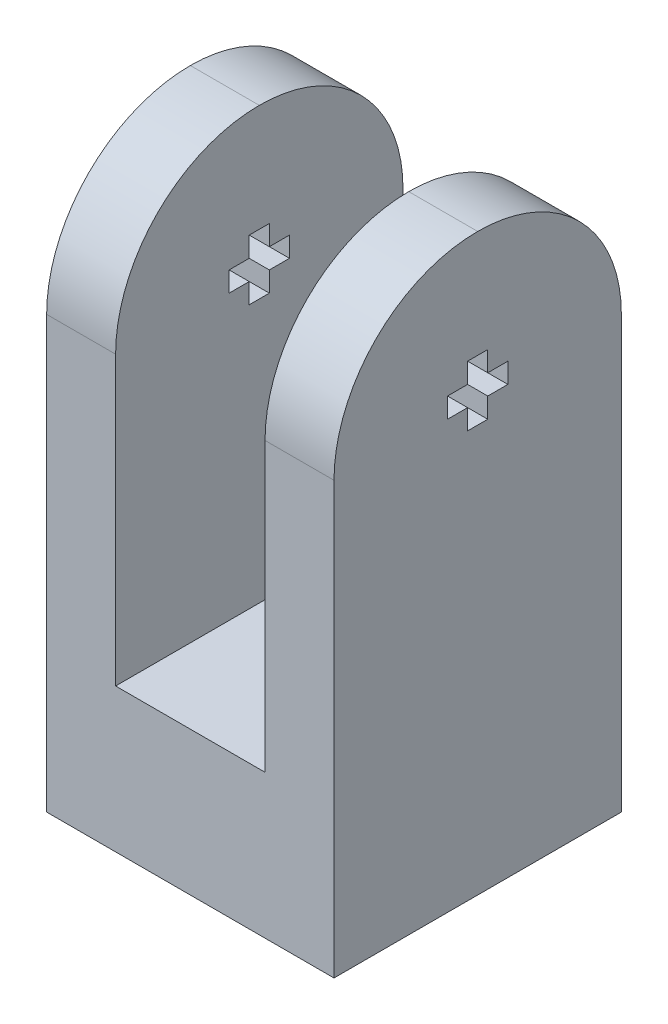
ISO-10303-21;
HEADER;
FILE_DESCRIPTION(('STEP AP214'),'2;1');
FILE_NAME('part.step','',(''),(''),'','','');
FILE_SCHEMA(('AUTOMOTIVE_DESIGN { 1 0 10303 214 1 1 1 1 }'));
ENDSEC;
DATA;
#1=APPLICATION_CONTEXT('core data for automotive mechanical design processes');
#2=APPLICATION_PROTOCOL_DEFINITION('international standard','automotive_design',2000,#1);
#3=PRODUCT_CONTEXT('',#1,'mechanical');
#4=PRODUCT('Part','Part','',(#3));
#5=PRODUCT_RELATED_PRODUCT_CATEGORY('part','',(#4));
#6=PRODUCT_DEFINITION_FORMATION('','',#4);
#7=PRODUCT_DEFINITION_CONTEXT('part definition',#1,'design');
#8=PRODUCT_DEFINITION('design','',#6,#7);
#9=PRODUCT_DEFINITION_SHAPE('','',#8);
#10=(LENGTH_UNIT() NAMED_UNIT(*) SI_UNIT(.MILLI.,.METRE.));
#11=(NAMED_UNIT(*) PLANE_ANGLE_UNIT() SI_UNIT($,.RADIAN.));
#12=(NAMED_UNIT(*) SI_UNIT($,.STERADIAN.) SOLID_ANGLE_UNIT());
#13=UNCERTAINTY_MEASURE_WITH_UNIT(LENGTH_MEASURE(1.E-05),#10,'distance_accuracy_value','');
#14=(GEOMETRIC_REPRESENTATION_CONTEXT(3) GLOBAL_UNCERTAINTY_ASSIGNED_CONTEXT((#13)) GLOBAL_UNIT_ASSIGNED_CONTEXT((#10,
#11,#12)) REPRESENTATION_CONTEXT('',''));
#15=CARTESIAN_POINT('',(0.,0.,0.));
#16=DIRECTION('',(0.,0.,1.));
#17=DIRECTION('',(1.,0.,0.));
#18=AXIS2_PLACEMENT_3D('',#15,#16,#17);
#19=CARTESIAN_POINT('',(12.7,50.8,12.7));
#20=DIRECTION('',(-1.,0.,0.));
#21=DIRECTION('',(0.,0.,1.));
#22=AXIS2_PLACEMENT_3D('',#19,#20,#21);
#23=PLANE('',#22);
#24=DIRECTION('',(0.,0.,-1.));
#25=VECTOR('',#24,1.);
#26=CARTESIAN_POINT('',(12.7,37.7560235760485,-0.888999999999999));
#27=LINE('',#26,#25);
#28=CARTESIAN_POINT('',(12.7,37.7560235760485,-0.888999999999999));
#29=VERTEX_POINT('',#28);
#30=CARTESIAN_POINT('',(12.7,37.7560235760485,-2.667));
#31=VERTEX_POINT('',#30);
#32=EDGE_CURVE('E326',#29,#31,#27,.T.);
#33=ORIENTED_EDGE('',*,*,#32,.F.);
#34=DIRECTION('',(0.,1.,0.));
#35=VECTOR('',#34,1.);
#36=CARTESIAN_POINT('',(12.7,37.7560235760485,-0.888999999999999));
#37=LINE('',#36,#35);
#38=CARTESIAN_POINT('',(12.7,35.9780235760485,-0.888999999999999));
#39=VERTEX_POINT('',#38);
#40=EDGE_CURVE('E324',#39,#29,#37,.T.);
#41=ORIENTED_EDGE('',*,*,#40,.F.);
#42=DIRECTION('',(0.,0.,-1.));
#43=VECTOR('',#42,1.);
#44=CARTESIAN_POINT('',(12.7,35.9780235760485,0.888999999999999));
#45=LINE('',#44,#43);
#46=CARTESIAN_POINT('',(12.7,35.9780235760485,0.888999999999999));
#47=VERTEX_POINT('',#46);
#48=EDGE_CURVE('E293',#47,#39,#45,.T.);
#49=ORIENTED_EDGE('',*,*,#48,.F.);
#50=DIRECTION('',(0.,-1.,0.));
#51=VECTOR('',#50,1.);
#52=CARTESIAN_POINT('',(12.7,37.7560235760485,0.888999999999999));
#53=LINE('',#52,#51);
#54=CARTESIAN_POINT('',(12.7,37.7560235760485,0.888999999999999));
#55=VERTEX_POINT('',#54);
#56=EDGE_CURVE('E296',#55,#47,#53,.T.);
#57=ORIENTED_EDGE('',*,*,#56,.F.);
#58=DIRECTION('',(0.,0.,-1.));
#59=VECTOR('',#58,1.);
#60=CARTESIAN_POINT('',(12.7,37.7560235760485,2.667));
#61=LINE('',#60,#59);
#62=CARTESIAN_POINT('',(12.7,37.7560235760485,2.667));
#63=VERTEX_POINT('',#62);
#64=EDGE_CURVE('E351',#63,#55,#61,.T.);
#65=ORIENTED_EDGE('',*,*,#64,.F.);
#66=DIRECTION('',(0.,-1.,0.));
#67=VECTOR('',#66,1.);
#68=CARTESIAN_POINT('',(12.7,39.5340235760485,2.667));
#69=LINE('',#68,#67);
#70=CARTESIAN_POINT('',(12.7,39.5340235760485,2.667));
#71=VERTEX_POINT('',#70);
#72=EDGE_CURVE('E348',#71,#63,#69,.T.);
#73=ORIENTED_EDGE('',*,*,#72,.F.);
#74=DIRECTION('',(0.,0.,1.));
#75=VECTOR('',#74,1.);
#76=CARTESIAN_POINT('',(12.7,39.5340235760485,2.667));
#77=LINE('',#76,#75);
#78=CARTESIAN_POINT('',(12.7,39.5340235760485,0.888999999999999));
#79=VERTEX_POINT('',#78);
#80=EDGE_CURVE('E345',#79,#71,#77,.T.);
#81=ORIENTED_EDGE('',*,*,#80,.F.);
#82=DIRECTION('',(0.,-1.,0.));
#83=VECTOR('',#82,1.);
#84=CARTESIAN_POINT('',(12.7,41.3120235760485,0.888999999999999));
#85=LINE('',#84,#83);
#86=CARTESIAN_POINT('',(12.7,41.3120235760485,0.888999999999999));
#87=VERTEX_POINT('',#86);
#88=EDGE_CURVE('E342',#87,#79,#85,.T.);
#89=ORIENTED_EDGE('',*,*,#88,.F.);
#90=DIRECTION('',(0.,0.,1.));
#91=VECTOR('',#90,1.);
#92=CARTESIAN_POINT('',(12.7,41.3120235760485,0.888999999999999));
#93=LINE('',#92,#91);
#94=CARTESIAN_POINT('',(12.7,41.3120235760485,-0.888999999999999));
#95=VERTEX_POINT('',#94);
#96=EDGE_CURVE('E339',#95,#87,#93,.T.);
#97=ORIENTED_EDGE('',*,*,#96,.F.);
#98=DIRECTION('',(0.,1.,0.));
#99=VECTOR('',#98,1.);
#100=CARTESIAN_POINT('',(12.7,41.3120235760485,-0.888999999999999));
#101=LINE('',#100,#99);
#102=CARTESIAN_POINT('',(12.7,39.5340235760485,-0.888999999999999));
#103=VERTEX_POINT('',#102);
#104=EDGE_CURVE('E336',#103,#95,#101,.T.);
#105=ORIENTED_EDGE('',*,*,#104,.F.);
#106=DIRECTION('',(0.,0.,1.));
#107=VECTOR('',#106,1.);
#108=CARTESIAN_POINT('',(12.7,39.5340235760485,-0.888999999999999));
#109=LINE('',#108,#107);
#110=CARTESIAN_POINT('',(12.7,39.5340235760485,-2.667));
#111=VERTEX_POINT('',#110);
#112=EDGE_CURVE('E333',#111,#103,#109,.T.);
#113=ORIENTED_EDGE('',*,*,#112,.F.);
#114=DIRECTION('',(0.,1.,0.));
#115=VECTOR('',#114,1.);
#116=CARTESIAN_POINT('',(12.7,39.5340235760485,-2.667));
#117=LINE('',#116,#115);
#118=EDGE_CURVE('E330',#31,#111,#117,.T.);
#119=ORIENTED_EDGE('',*,*,#118,.F.);
#120=EDGE_LOOP('',(#33,#41,#49,#57,#65,#73,#81,#89,#97,#105,#113,#119));
#121=FACE_BOUND('',#120,.T.);
#122=DIRECTION('',(0.,-1.,0.));
#123=VECTOR('',#122,1.);
#124=CARTESIAN_POINT('',(12.7,50.8,-12.7));
#125=LINE('',#124,#123);
#126=CARTESIAN_POINT('',(12.7,38.1,-12.7));
#127=VERTEX_POINT('',#126);
#128=CARTESIAN_POINT('',(12.7,0.,-12.7));
#129=VERTEX_POINT('',#128);
#130=EDGE_CURVE('E472',#127,#129,#125,.T.);
#131=ORIENTED_EDGE('',*,*,#130,.F.);
#132=CARTESIAN_POINT('',(12.7,38.1,0.));
#133=DIRECTION('',(-1.,0.,0.));
#134=DIRECTION('',(0.,0.,1.));
#135=AXIS2_PLACEMENT_3D('',#132,#133,#134);
#136=CIRCLE('',#135,12.7);
#137=CARTESIAN_POINT('',(12.7,50.8,0.));
#138=VERTEX_POINT('',#137);
#139=EDGE_CURVE('E519',#127,#138,#136,.F.);
#140=ORIENTED_EDGE('',*,*,#139,.T.);
#141=CARTESIAN_POINT('',(12.7,38.1,0.));
#142=DIRECTION('',(-1.,0.,0.));
#143=DIRECTION('',(0.,0.,1.));
#144=AXIS2_PLACEMENT_3D('',#141,#142,#143);
#145=CIRCLE('',#144,12.7);
#146=CARTESIAN_POINT('',(12.7,38.1,12.7));
#147=VERTEX_POINT('',#146);
#148=EDGE_CURVE('E517',#138,#147,#145,.F.);
#149=ORIENTED_EDGE('',*,*,#148,.T.);
#150=DIRECTION('',(0.,-1.,0.));
#151=VECTOR('',#150,1.);
#152=CARTESIAN_POINT('',(12.7,50.8,12.7));
#153=LINE('',#152,#151);
#154=CARTESIAN_POINT('',(12.7,0.,12.7));
#155=VERTEX_POINT('',#154);
#156=EDGE_CURVE('E466',#147,#155,#153,.T.);
#157=ORIENTED_EDGE('',*,*,#156,.T.);
#158=DIRECTION('',(0.,0.,-1.));
#159=VECTOR('',#158,1.);
#160=CARTESIAN_POINT('',(12.7,0.,12.7));
#161=LINE('',#160,#159);
#162=EDGE_CURVE('E448',#155,#129,#161,.T.);
#163=ORIENTED_EDGE('',*,*,#162,.T.);
#164=EDGE_LOOP('',(#131,#140,#149,#157,#163));
#165=FACE_BOUND('',#164,.T.);
#166=ADVANCED_FACE('F44',(#121,#165),#23,.F.);
#167=CARTESIAN_POINT('',(-12.7,50.8,-12.7));
#168=DIRECTION('',(0.,0.,1.));
#169=DIRECTION('',(1.,0.,0.));
#170=AXIS2_PLACEMENT_3D('',#167,#168,#169);
#171=PLANE('',#170);
#172=DIRECTION('',(0.,1.,0.));
#173=VECTOR('',#172,1.);
#174=CARTESIAN_POINT('',(6.604,12.7,-12.7));
#175=LINE('',#174,#173);
#176=CARTESIAN_POINT('',(6.604,12.7,-12.7));
#177=VERTEX_POINT('',#176);
#178=CARTESIAN_POINT('',(6.604,38.1,-12.7));
#179=VERTEX_POINT('',#178);
#180=EDGE_CURVE('E444',#177,#179,#175,.T.);
#181=ORIENTED_EDGE('',*,*,#180,.T.);
#182=DIRECTION('',(-1.,0.,0.));
#183=VECTOR('',#182,1.);
#184=CARTESIAN_POINT('',(-12.7,38.1,-12.7));
#185=LINE('',#184,#183);
#186=EDGE_CURVE('E514',#179,#127,#185,.F.);
#187=ORIENTED_EDGE('',*,*,#186,.T.);
#188=ORIENTED_EDGE('',*,*,#130,.T.);
#189=DIRECTION('',(-1.,0.,0.));
#190=VECTOR('',#189,1.);
#191=CARTESIAN_POINT('',(-12.7,0.,-12.7));
#192=LINE('',#191,#190);
#193=CARTESIAN_POINT('',(-12.7,0.,-12.7));
#194=VERTEX_POINT('',#193);
#195=EDGE_CURVE('E457',#129,#194,#192,.T.);
#196=ORIENTED_EDGE('',*,*,#195,.T.);
#197=DIRECTION('',(0.,-1.,0.));
#198=VECTOR('',#197,1.);
#199=CARTESIAN_POINT('',(-12.7,50.8,-12.7));
#200=LINE('',#199,#198);
#201=CARTESIAN_POINT('',(-12.7,38.1,-12.7));
#202=VERTEX_POINT('',#201);
#203=EDGE_CURVE('E470',#202,#194,#200,.T.);
#204=ORIENTED_EDGE('',*,*,#203,.F.);
#205=DIRECTION('',(-1.,0.,0.));
#206=VECTOR('',#205,1.);
#207=CARTESIAN_POINT('',(-12.7,38.1,-12.7));
#208=LINE('',#207,#206);
#209=CARTESIAN_POINT('',(-6.604,38.1,-12.7));
#210=VERTEX_POINT('',#209);
#211=EDGE_CURVE('E511',#202,#210,#208,.F.);
#212=ORIENTED_EDGE('',*,*,#211,.T.);
#213=DIRECTION('',(0.,1.,0.));
#214=VECTOR('',#213,1.);
#215=CARTESIAN_POINT('',(-6.604,12.7,-12.7));
#216=LINE('',#215,#214);
#217=CARTESIAN_POINT('',(-6.604,12.7,-12.7));
#218=VERTEX_POINT('',#217);
#219=EDGE_CURVE('E451',#218,#210,#216,.T.);
#220=ORIENTED_EDGE('',*,*,#219,.F.);
#221=DIRECTION('',(-1.,0.,0.));
#222=VECTOR('',#221,1.);
#223=CARTESIAN_POINT('',(-6.604,12.7,-12.7));
#224=LINE('',#223,#222);
#225=EDGE_CURVE('E435',#177,#218,#224,.T.);
#226=ORIENTED_EDGE('',*,*,#225,.F.);
#227=EDGE_LOOP('',(#181,#187,#188,#196,#204,#212,#220,#226));
#228=FACE_BOUND('',#227,.T.);
#229=ADVANCED_FACE('F567',(#228),#171,.F.);
#230=CARTESIAN_POINT('',(-12.7,50.8,12.7));
#231=DIRECTION('',(1.,0.,0.));
#232=DIRECTION('',(0.,0.,-1.));
#233=AXIS2_PLACEMENT_3D('',#230,#231,#232);
#234=PLANE('',#233);
#235=DIRECTION('',(0.,0.,-1.));
#236=VECTOR('',#235,1.);
#237=CARTESIAN_POINT('',(-12.7,35.9780235760485,0.888999999999999));
#238=LINE('',#237,#236);
#239=CARTESIAN_POINT('',(-12.7,35.9780235760485,0.888999999999999));
#240=VERTEX_POINT('',#239);
#241=CARTESIAN_POINT('',(-12.7,35.9780235760485,-0.888999999999999));
#242=VERTEX_POINT('',#241);
#243=EDGE_CURVE('E292',#240,#242,#238,.T.);
#244=ORIENTED_EDGE('',*,*,#243,.T.);
#245=DIRECTION('',(0.,1.,0.));
#246=VECTOR('',#245,1.);
#247=CARTESIAN_POINT('',(-12.7,37.7560235760485,-0.888999999999999));
#248=LINE('',#247,#246);
#249=CARTESIAN_POINT('',(-12.7,37.7560235760485,-0.888999999999999));
#250=VERTEX_POINT('',#249);
#251=EDGE_CURVE('E269',#242,#250,#248,.T.);
#252=ORIENTED_EDGE('',*,*,#251,.T.);
#253=DIRECTION('',(0.,0.,-1.));
#254=VECTOR('',#253,1.);
#255=CARTESIAN_POINT('',(-12.7,37.7560235760485,-0.888999999999999));
#256=LINE('',#255,#254);
#257=CARTESIAN_POINT('',(-12.7,37.7560235760485,-2.667));
#258=VERTEX_POINT('',#257);
#259=EDGE_CURVE('E280',#250,#258,#256,.T.);
#260=ORIENTED_EDGE('',*,*,#259,.T.);
#261=DIRECTION('',(0.,1.,0.));
#262=VECTOR('',#261,1.);
#263=CARTESIAN_POINT('',(-12.7,39.5340235760485,-2.667));
#264=LINE('',#263,#262);
#265=CARTESIAN_POINT('',(-12.7,39.5340235760485,-2.667));
#266=VERTEX_POINT('',#265);
#267=EDGE_CURVE('E286',#258,#266,#264,.T.);
#268=ORIENTED_EDGE('',*,*,#267,.T.);
#269=DIRECTION('',(0.,0.,1.));
#270=VECTOR('',#269,1.);
#271=CARTESIAN_POINT('',(-12.7,39.5340235760485,-0.888999999999999));
#272=LINE('',#271,#270);
#273=CARTESIAN_POINT('',(-12.7,39.5340235760485,-0.888999999999999));
#274=VERTEX_POINT('',#273);
#275=EDGE_CURVE('E300',#266,#274,#272,.T.);
#276=ORIENTED_EDGE('',*,*,#275,.T.);
#277=DIRECTION('',(0.,1.,0.));
#278=VECTOR('',#277,1.);
#279=CARTESIAN_POINT('',(-12.7,41.3120235760485,-0.888999999999999));
#280=LINE('',#279,#278);
#281=CARTESIAN_POINT('',(-12.7,41.3120235760485,-0.888999999999999));
#282=VERTEX_POINT('',#281);
#283=EDGE_CURVE('E303',#274,#282,#280,.T.);
#284=ORIENTED_EDGE('',*,*,#283,.T.);
#285=DIRECTION('',(0.,0.,1.));
#286=VECTOR('',#285,1.);
#287=CARTESIAN_POINT('',(-12.7,41.3120235760485,0.888999999999999));
#288=LINE('',#287,#286);
#289=CARTESIAN_POINT('',(-12.7,41.3120235760485,0.888999999999999));
#290=VERTEX_POINT('',#289);
#291=EDGE_CURVE('E306',#282,#290,#288,.T.);
#292=ORIENTED_EDGE('',*,*,#291,.T.);
#293=DIRECTION('',(0.,-1.,0.));
#294=VECTOR('',#293,1.);
#295=CARTESIAN_POINT('',(-12.7,41.3120235760485,0.888999999999999));
#296=LINE('',#295,#294);
#297=CARTESIAN_POINT('',(-12.7,39.5340235760485,0.888999999999999));
#298=VERTEX_POINT('',#297);
#299=EDGE_CURVE('E309',#290,#298,#296,.T.);
#300=ORIENTED_EDGE('',*,*,#299,.T.);
#301=DIRECTION('',(0.,0.,1.));
#302=VECTOR('',#301,1.);
#303=CARTESIAN_POINT('',(-12.7,39.5340235760485,2.667));
#304=LINE('',#303,#302);
#305=CARTESIAN_POINT('',(-12.7,39.5340235760485,2.667));
#306=VERTEX_POINT('',#305);
#307=EDGE_CURVE('E312',#298,#306,#304,.T.);
#308=ORIENTED_EDGE('',*,*,#307,.T.);
#309=DIRECTION('',(0.,-1.,0.));
#310=VECTOR('',#309,1.);
#311=CARTESIAN_POINT('',(-12.7,39.5340235760485,2.667));
#312=LINE('',#311,#310);
#313=CARTESIAN_POINT('',(-12.7,37.7560235760485,2.667));
#314=VERTEX_POINT('',#313);
#315=EDGE_CURVE('E315',#306,#314,#312,.T.);
#316=ORIENTED_EDGE('',*,*,#315,.T.);
#317=DIRECTION('',(0.,0.,-1.));
#318=VECTOR('',#317,1.);
#319=CARTESIAN_POINT('',(-12.7,37.7560235760485,2.667));
#320=LINE('',#319,#318);
#321=CARTESIAN_POINT('',(-12.7,37.7560235760485,0.888999999999999));
#322=VERTEX_POINT('',#321);
#323=EDGE_CURVE('E318',#314,#322,#320,.T.);
#324=ORIENTED_EDGE('',*,*,#323,.T.);
#325=DIRECTION('',(0.,-1.,0.));
#326=VECTOR('',#325,1.);
#327=CARTESIAN_POINT('',(-12.7,37.7560235760485,0.888999999999999));
#328=LINE('',#327,#326);
#329=EDGE_CURVE('E321',#322,#240,#328,.T.);
#330=ORIENTED_EDGE('',*,*,#329,.T.);
#331=EDGE_LOOP('',(#244,#252,#260,#268,#276,#284,#292,#300,#308,#316,#324,#330));
#332=FACE_BOUND('',#331,.T.);
#333=CARTESIAN_POINT('',(-12.7,38.1,0.));
#334=DIRECTION('',(1.,0.,0.));
#335=DIRECTION('',(0.,0.,-1.));
#336=AXIS2_PLACEMENT_3D('',#333,#334,#335);
#337=CIRCLE('',#336,12.7);
#338=CARTESIAN_POINT('',(-12.7,38.1,12.7));
#339=VERTEX_POINT('',#338);
#340=CARTESIAN_POINT('',(-12.7,50.8,0.));
#341=VERTEX_POINT('',#340);
#342=EDGE_CURVE('E521',#339,#341,#337,.F.);
#343=ORIENTED_EDGE('',*,*,#342,.T.);
#344=CARTESIAN_POINT('',(-12.7,38.1,0.));
#345=DIRECTION('',(1.,0.,0.));
#346=DIRECTION('',(0.,0.,-1.));
#347=AXIS2_PLACEMENT_3D('',#344,#345,#346);
#348=CIRCLE('',#347,12.7);
#349=EDGE_CURVE('E523',#341,#202,#348,.F.);
#350=ORIENTED_EDGE('',*,*,#349,.T.);
#351=ORIENTED_EDGE('',*,*,#203,.T.);
#352=DIRECTION('',(0.,0.,1.));
#353=VECTOR('',#352,1.);
#354=CARTESIAN_POINT('',(-12.7,0.,12.7));
#355=LINE('',#354,#353);
#356=CARTESIAN_POINT('',(-12.7,0.,12.7));
#357=VERTEX_POINT('',#356);
#358=EDGE_CURVE('E460',#194,#357,#355,.T.);
#359=ORIENTED_EDGE('',*,*,#358,.T.);
#360=DIRECTION('',(0.,-1.,0.));
#361=VECTOR('',#360,1.);
#362=CARTESIAN_POINT('',(-12.7,50.8,12.7));
#363=LINE('',#362,#361);
#364=EDGE_CURVE('E468',#339,#357,#363,.T.);
#365=ORIENTED_EDGE('',*,*,#364,.F.);
#366=EDGE_LOOP('',(#343,#350,#351,#359,#365));
#367=FACE_BOUND('',#366,.T.);
#368=ADVANCED_FACE('F288',(#332,#367),#234,.F.);
#369=CARTESIAN_POINT('',(-12.7,50.8,12.7));
#370=DIRECTION('',(0.,0.,-1.));
#371=DIRECTION('',(-1.,0.,0.));
#372=AXIS2_PLACEMENT_3D('',#369,#370,#371);
#373=PLANE('',#372);
#374=DIRECTION('',(0.,1.,0.));
#375=VECTOR('',#374,1.);
#376=CARTESIAN_POINT('',(-6.604,12.7,12.7));
#377=LINE('',#376,#375);
#378=CARTESIAN_POINT('',(-6.604,12.7,12.7));
#379=VERTEX_POINT('',#378);
#380=CARTESIAN_POINT('',(-6.604,38.1,12.7));
#381=VERTEX_POINT('',#380);
#382=EDGE_CURVE('E449',#379,#381,#377,.T.);
#383=ORIENTED_EDGE('',*,*,#382,.T.);
#384=DIRECTION('',(1.,0.,0.));
#385=VECTOR('',#384,1.);
#386=CARTESIAN_POINT('',(-12.7,38.1,12.7));
#387=LINE('',#386,#385);
#388=EDGE_CURVE('E11',#381,#339,#387,.F.);
#389=ORIENTED_EDGE('',*,*,#388,.T.);
#390=ORIENTED_EDGE('',*,*,#364,.T.);
#391=DIRECTION('',(1.,0.,0.));
#392=VECTOR('',#391,1.);
#393=CARTESIAN_POINT('',(-12.7,0.,12.7));
#394=LINE('',#393,#392);
#395=EDGE_CURVE('E463',#357,#155,#394,.T.);
#396=ORIENTED_EDGE('',*,*,#395,.T.);
#397=ORIENTED_EDGE('',*,*,#156,.F.);
#398=DIRECTION('',(1.,0.,0.));
#399=VECTOR('',#398,1.);
#400=CARTESIAN_POINT('',(-12.7,38.1,12.7));
#401=LINE('',#400,#399);
#402=CARTESIAN_POINT('',(6.604,38.1,12.7));
#403=VERTEX_POINT('',#402);
#404=EDGE_CURVE('E53',#147,#403,#401,.F.);
#405=ORIENTED_EDGE('',*,*,#404,.T.);
#406=DIRECTION('',(0.,1.,0.));
#407=VECTOR('',#406,1.);
#408=CARTESIAN_POINT('',(6.604,12.7,12.7));
#409=LINE('',#408,#407);
#410=CARTESIAN_POINT('',(6.604,12.7,12.7));
#411=VERTEX_POINT('',#410);
#412=EDGE_CURVE('E445',#411,#403,#409,.T.);
#413=ORIENTED_EDGE('',*,*,#412,.F.);
#414=DIRECTION('',(1.,0.,0.));
#415=VECTOR('',#414,1.);
#416=CARTESIAN_POINT('',(-6.604,12.7,12.7));
#417=LINE('',#416,#415);
#418=EDGE_CURVE('E441',#379,#411,#417,.T.);
#419=ORIENTED_EDGE('',*,*,#418,.F.);
#420=EDGE_LOOP('',(#383,#389,#390,#396,#397,#405,#413,#419));
#421=FACE_BOUND('',#420,.T.);
#422=ADVANCED_FACE('F542',(#421),#373,.F.);
#423=CARTESIAN_POINT('',(0.,0.,0.));
#424=DIRECTION('',(0.,-1.,0.));
#425=DIRECTION('',(0.,0.,-1.));
#426=AXIS2_PLACEMENT_3D('',#423,#424,#425);
#427=PLANE('',#426);
#428=ORIENTED_EDGE('',*,*,#162,.F.);
#429=ORIENTED_EDGE('',*,*,#395,.F.);
#430=ORIENTED_EDGE('',*,*,#358,.F.);
#431=ORIENTED_EDGE('',*,*,#195,.F.);
#432=EDGE_LOOP('',(#428,#429,#430,#431));
#433=FACE_BOUND('',#432,.T.);
#434=ADVANCED_FACE('F550',(#433),#427,.T.);
#435=CARTESIAN_POINT('',(6.604,12.7,12.7));
#436=DIRECTION('',(1.,0.,0.));
#437=DIRECTION('',(0.,0.,-1.));
#438=AXIS2_PLACEMENT_3D('',#435,#436,#437);
#439=PLANE('',#438);
#440=DIRECTION('',(0.,0.,-1.));
#441=VECTOR('',#440,1.);
#442=CARTESIAN_POINT('',(6.604,35.9780235760485,12.7));
#443=LINE('',#442,#441);
#444=CARTESIAN_POINT('',(6.604,35.9780235760485,0.888999999999999));
#445=VERTEX_POINT('',#444);
#446=CARTESIAN_POINT('',(6.604,35.9780235760485,-0.888999999999999));
#447=VERTEX_POINT('',#446);
#448=EDGE_CURVE('E426',#445,#447,#443,.T.);
#449=ORIENTED_EDGE('',*,*,#448,.T.);
#450=DIRECTION('',(0.,1.,0.));
#451=VECTOR('',#450,1.);
#452=CARTESIAN_POINT('',(6.604,12.7,-0.888999999999999));
#453=LINE('',#452,#451);
#454=CARTESIAN_POINT('',(6.604,37.7560235760485,-0.888999999999999));
#455=VERTEX_POINT('',#454);
#456=EDGE_CURVE('E429',#447,#455,#453,.T.);
#457=ORIENTED_EDGE('',*,*,#456,.T.);
#458=DIRECTION('',(0.,0.,-1.));
#459=VECTOR('',#458,1.);
#460=CARTESIAN_POINT('',(6.604,37.7560235760485,12.7));
#461=LINE('',#460,#459);
#462=CARTESIAN_POINT('',(6.604,37.7560235760485,-2.667));
#463=VERTEX_POINT('',#462);
#464=EDGE_CURVE('E358',#455,#463,#461,.T.);
#465=ORIENTED_EDGE('',*,*,#464,.T.);
#466=DIRECTION('',(0.,1.,0.));
#467=VECTOR('',#466,1.);
#468=CARTESIAN_POINT('',(6.604,12.7,-2.667));
#469=LINE('',#468,#467);
#470=CARTESIAN_POINT('',(6.604,39.5340235760485,-2.667));
#471=VERTEX_POINT('',#470);
#472=EDGE_CURVE('E399',#463,#471,#469,.T.);
#473=ORIENTED_EDGE('',*,*,#472,.T.);
#474=DIRECTION('',(0.,0.,1.));
#475=VECTOR('',#474,1.);
#476=CARTESIAN_POINT('',(6.604,39.5340235760485,12.7));
#477=LINE('',#476,#475);
#478=CARTESIAN_POINT('',(6.604,39.5340235760485,-0.888999999999999));
#479=VERTEX_POINT('',#478);
#480=EDGE_CURVE('E402',#471,#479,#477,.T.);
#481=ORIENTED_EDGE('',*,*,#480,.T.);
#482=DIRECTION('',(0.,1.,0.));
#483=VECTOR('',#482,1.);
#484=CARTESIAN_POINT('',(6.604,12.7,-0.888999999999999));
#485=LINE('',#484,#483);
#486=CARTESIAN_POINT('',(6.604,41.3120235760485,-0.888999999999999));
#487=VERTEX_POINT('',#486);
#488=EDGE_CURVE('E405',#479,#487,#485,.T.);
#489=ORIENTED_EDGE('',*,*,#488,.T.);
#490=DIRECTION('',(0.,0.,1.));
#491=VECTOR('',#490,1.);
#492=CARTESIAN_POINT('',(6.604,41.3120235760485,12.7));
#493=LINE('',#492,#491);
#494=CARTESIAN_POINT('',(6.604,41.3120235760485,0.888999999999999));
#495=VERTEX_POINT('',#494);
#496=EDGE_CURVE('E408',#487,#495,#493,.T.);
#497=ORIENTED_EDGE('',*,*,#496,.T.);
#498=DIRECTION('',(0.,-1.,0.));
#499=VECTOR('',#498,1.);
#500=CARTESIAN_POINT('',(6.604,12.7,0.888999999999999));
#501=LINE('',#500,#499);
#502=CARTESIAN_POINT('',(6.604,39.5340235760485,0.888999999999999));
#503=VERTEX_POINT('',#502);
#504=EDGE_CURVE('E411',#495,#503,#501,.T.);
#505=ORIENTED_EDGE('',*,*,#504,.T.);
#506=DIRECTION('',(0.,0.,1.));
#507=VECTOR('',#506,1.);
#508=CARTESIAN_POINT('',(6.604,39.5340235760485,12.7));
#509=LINE('',#508,#507);
#510=CARTESIAN_POINT('',(6.604,39.5340235760485,2.667));
#511=VERTEX_POINT('',#510);
#512=EDGE_CURVE('E414',#503,#511,#509,.T.);
#513=ORIENTED_EDGE('',*,*,#512,.T.);
#514=DIRECTION('',(0.,-1.,0.));
#515=VECTOR('',#514,1.);
#516=CARTESIAN_POINT('',(6.604,12.7,2.66699999999998));
#517=LINE('',#516,#515);
#518=CARTESIAN_POINT('',(6.604,37.7560235760485,2.667));
#519=VERTEX_POINT('',#518);
#520=EDGE_CURVE('E417',#511,#519,#517,.T.);
#521=ORIENTED_EDGE('',*,*,#520,.T.);
#522=DIRECTION('',(0.,0.,-1.));
#523=VECTOR('',#522,1.);
#524=CARTESIAN_POINT('',(6.604,37.7560235760485,12.7));
#525=LINE('',#524,#523);
#526=CARTESIAN_POINT('',(6.604,37.7560235760485,0.888999999999999));
#527=VERTEX_POINT('',#526);
#528=EDGE_CURVE('E420',#519,#527,#525,.T.);
#529=ORIENTED_EDGE('',*,*,#528,.T.);
#530=DIRECTION('',(0.,-1.,0.));
#531=VECTOR('',#530,1.);
#532=CARTESIAN_POINT('',(6.604,12.7,0.888999999999999));
#533=LINE('',#532,#531);
#534=EDGE_CURVE('E423',#527,#445,#533,.T.);
#535=ORIENTED_EDGE('',*,*,#534,.T.);
#536=EDGE_LOOP('',(#449,#457,#465,#473,#481,#489,#497,#505,#513,#521,#529,#535));
#537=FACE_BOUND('',#536,.T.);
#538=CARTESIAN_POINT('',(6.604,38.1,0.));
#539=DIRECTION('',(1.,0.,0.));
#540=DIRECTION('',(0.,0.,-1.));
#541=AXIS2_PLACEMENT_3D('',#538,#539,#540);
#542=CIRCLE('',#541,12.7);
#543=CARTESIAN_POINT('',(6.604,50.8,0.));
#544=VERTEX_POINT('',#543);
#545=EDGE_CURVE('E507',#403,#544,#542,.F.);
#546=ORIENTED_EDGE('',*,*,#545,.T.);
#547=CARTESIAN_POINT('',(6.604,38.1,0.));
#548=DIRECTION('',(1.,0.,0.));
#549=DIRECTION('',(0.,0.,-1.));
#550=AXIS2_PLACEMENT_3D('',#547,#548,#549);
#551=CIRCLE('',#550,12.7);
#552=EDGE_CURVE('E509',#544,#179,#551,.F.);
#553=ORIENTED_EDGE('',*,*,#552,.T.);
#554=ORIENTED_EDGE('',*,*,#180,.F.);
#555=DIRECTION('',(0.,0.,-1.));
#556=VECTOR('',#555,1.);
#557=CARTESIAN_POINT('',(6.604,12.7,12.7));
#558=LINE('',#557,#556);
#559=EDGE_CURVE('E432',#411,#177,#558,.T.);
#560=ORIENTED_EDGE('',*,*,#559,.F.);
#561=ORIENTED_EDGE('',*,*,#412,.T.);
#562=EDGE_LOOP('',(#546,#553,#554,#560,#561));
#563=FACE_BOUND('',#562,.T.);
#564=ADVANCED_FACE('F560',(#537,#563),#439,.F.);
#565=CARTESIAN_POINT('',(-6.604,12.7,12.7));
#566=DIRECTION('',(-1.,0.,0.));
#567=DIRECTION('',(0.,0.,1.));
#568=AXIS2_PLACEMENT_3D('',#565,#566,#567);
#569=PLANE('',#568);
#570=DIRECTION('',(0.,0.,1.));
#571=VECTOR('',#570,1.);
#572=CARTESIAN_POINT('',(-6.604,37.7560235760485,12.7));
#573=LINE('',#572,#571);
#574=CARTESIAN_POINT('',(-6.604,37.7560235760485,-2.667));
#575=VERTEX_POINT('',#574);
#576=CARTESIAN_POINT('',(-6.604,37.7560235760485,-0.888999999999999));
#577=VERTEX_POINT('',#576);
#578=EDGE_CURVE('E474',#575,#577,#573,.T.);
#579=ORIENTED_EDGE('',*,*,#578,.T.);
#580=DIRECTION('',(0.,-1.,0.));
#581=VECTOR('',#580,1.);
#582=CARTESIAN_POINT('',(-6.604,12.7,-0.888999999999999));
#583=LINE('',#582,#581);
#584=CARTESIAN_POINT('',(-6.604,35.9780235760485,-0.888999999999999));
#585=VERTEX_POINT('',#584);
#586=EDGE_CURVE('E272',#577,#585,#583,.T.);
#587=ORIENTED_EDGE('',*,*,#586,.T.);
#588=DIRECTION('',(0.,0.,1.));
#589=VECTOR('',#588,1.);
#590=CARTESIAN_POINT('',(-6.604,35.9780235760485,12.7));
#591=LINE('',#590,#589);
#592=CARTESIAN_POINT('',(-6.604,35.9780235760485,0.888999999999999));
#593=VERTEX_POINT('',#592);
#594=EDGE_CURVE('E503',#585,#593,#591,.T.);
#595=ORIENTED_EDGE('',*,*,#594,.T.);
#596=DIRECTION('',(0.,1.,0.));
#597=VECTOR('',#596,1.);
#598=CARTESIAN_POINT('',(-6.604,12.7,0.888999999999999));
#599=LINE('',#598,#597);
#600=CARTESIAN_POINT('',(-6.604,37.7560235760485,0.888999999999999));
#601=VERTEX_POINT('',#600);
#602=EDGE_CURVE('E500',#593,#601,#599,.T.);
#603=ORIENTED_EDGE('',*,*,#602,.T.);
#604=DIRECTION('',(0.,0.,1.));
#605=VECTOR('',#604,1.);
#606=CARTESIAN_POINT('',(-6.604,37.7560235760485,12.7));
#607=LINE('',#606,#605);
#608=CARTESIAN_POINT('',(-6.604,37.7560235760485,2.667));
#609=VERTEX_POINT('',#608);
#610=EDGE_CURVE('E497',#601,#609,#607,.T.);
#611=ORIENTED_EDGE('',*,*,#610,.T.);
#612=DIRECTION('',(0.,1.,0.));
#613=VECTOR('',#612,1.);
#614=CARTESIAN_POINT('',(-6.604,12.7,2.66699999999998));
#615=LINE('',#614,#613);
#616=CARTESIAN_POINT('',(-6.604,39.5340235760485,2.667));
#617=VERTEX_POINT('',#616);
#618=EDGE_CURVE('E494',#609,#617,#615,.T.);
#619=ORIENTED_EDGE('',*,*,#618,.T.);
#620=DIRECTION('',(0.,0.,-1.));
#621=VECTOR('',#620,1.);
#622=CARTESIAN_POINT('',(-6.604,39.5340235760485,12.7));
#623=LINE('',#622,#621);
#624=CARTESIAN_POINT('',(-6.604,39.5340235760485,0.888999999999999));
#625=VERTEX_POINT('',#624);
#626=EDGE_CURVE('E491',#617,#625,#623,.T.);
#627=ORIENTED_EDGE('',*,*,#626,.T.);
#628=DIRECTION('',(0.,1.,0.));
#629=VECTOR('',#628,1.);
#630=CARTESIAN_POINT('',(-6.604,12.7,0.888999999999999));
#631=LINE('',#630,#629);
#632=CARTESIAN_POINT('',(-6.604,41.3120235760485,0.888999999999999));
#633=VERTEX_POINT('',#632);
#634=EDGE_CURVE('E488',#625,#633,#631,.T.);
#635=ORIENTED_EDGE('',*,*,#634,.T.);
#636=DIRECTION('',(0.,0.,-1.));
#637=VECTOR('',#636,1.);
#638=CARTESIAN_POINT('',(-6.604,41.3120235760485,12.7));
#639=LINE('',#638,#637);
#640=CARTESIAN_POINT('',(-6.604,41.3120235760485,-0.888999999999999));
#641=VERTEX_POINT('',#640);
#642=EDGE_CURVE('E485',#633,#641,#639,.T.);
#643=ORIENTED_EDGE('',*,*,#642,.T.);
#644=DIRECTION('',(0.,-1.,0.));
#645=VECTOR('',#644,1.);
#646=CARTESIAN_POINT('',(-6.604,12.7,-0.888999999999999));
#647=LINE('',#646,#645);
#648=CARTESIAN_POINT('',(-6.604,39.5340235760485,-0.888999999999999));
#649=VERTEX_POINT('',#648);
#650=EDGE_CURVE('E482',#641,#649,#647,.T.);
#651=ORIENTED_EDGE('',*,*,#650,.T.);
#652=DIRECTION('',(0.,0.,-1.));
#653=VECTOR('',#652,1.);
#654=CARTESIAN_POINT('',(-6.604,39.5340235760485,12.7));
#655=LINE('',#654,#653);
#656=CARTESIAN_POINT('',(-6.604,39.5340235760485,-2.667));
#657=VERTEX_POINT('',#656);
#658=EDGE_CURVE('E479',#649,#657,#655,.T.);
#659=ORIENTED_EDGE('',*,*,#658,.T.);
#660=DIRECTION('',(0.,-1.,0.));
#661=VECTOR('',#660,1.);
#662=CARTESIAN_POINT('',(-6.604,12.7,-2.667));
#663=LINE('',#662,#661);
#664=EDGE_CURVE('E476',#657,#575,#663,.T.);
#665=ORIENTED_EDGE('',*,*,#664,.T.);
#666=EDGE_LOOP('',(#579,#587,#595,#603,#611,#619,#627,#635,#643,#651,#659,#665));
#667=FACE_BOUND('',#666,.T.);
#668=ORIENTED_EDGE('',*,*,#219,.T.);
#669=CARTESIAN_POINT('',(-6.604,38.1,0.));
#670=DIRECTION('',(-1.,0.,0.));
#671=DIRECTION('',(0.,0.,1.));
#672=AXIS2_PLACEMENT_3D('',#669,#670,#671);
#673=CIRCLE('',#672,12.7);
#674=CARTESIAN_POINT('',(-6.604,50.8,0.));
#675=VERTEX_POINT('',#674);
#676=EDGE_CURVE('E66',#210,#675,#673,.F.);
#677=ORIENTED_EDGE('',*,*,#676,.T.);
#678=CARTESIAN_POINT('',(-6.604,38.1,0.));
#679=DIRECTION('',(-1.,0.,0.));
#680=DIRECTION('',(0.,0.,1.));
#681=AXIS2_PLACEMENT_3D('',#678,#679,#680);
#682=CIRCLE('',#681,12.7);
#683=EDGE_CURVE('E61',#675,#381,#682,.F.);
#684=ORIENTED_EDGE('',*,*,#683,.T.);
#685=ORIENTED_EDGE('',*,*,#382,.F.);
#686=DIRECTION('',(0.,0.,1.));
#687=VECTOR('',#686,1.);
#688=CARTESIAN_POINT('',(-6.604,12.7,12.7));
#689=LINE('',#688,#687);
#690=EDGE_CURVE('E438',#218,#379,#689,.T.);
#691=ORIENTED_EDGE('',*,*,#690,.F.);
#692=EDGE_LOOP('',(#668,#677,#684,#685,#691));
#693=FACE_BOUND('',#692,.T.);
#694=ADVANCED_FACE('F565',(#667,#693),#569,.F.);
#695=CARTESIAN_POINT('',(0.,12.7,0.));
#696=DIRECTION('',(0.,-1.,0.));
#697=DIRECTION('',(0.,0.,-1.));
#698=AXIS2_PLACEMENT_3D('',#695,#696,#697);
#699=PLANE('',#698);
#700=ORIENTED_EDGE('',*,*,#559,.T.);
#701=ORIENTED_EDGE('',*,*,#225,.T.);
#702=ORIENTED_EDGE('',*,*,#690,.T.);
#703=ORIENTED_EDGE('',*,*,#418,.T.);
#704=EDGE_LOOP('',(#700,#701,#702,#703));
#705=FACE_BOUND('',#704,.T.);
#706=ADVANCED_FACE('F562',(#705),#699,.F.);
#707=CARTESIAN_POINT('',(-12.7,37.7560235760485,-0.888999999999999));
#708=DIRECTION('',(0.,-1.,0.));
#709=DIRECTION('',(0.,0.,-1.));
#710=AXIS2_PLACEMENT_3D('',#707,#708,#709);
#711=PLANE('',#710);
#712=DIRECTION('',(1.,0.,0.));
#713=VECTOR('',#712,1.);
#714=CARTESIAN_POINT('',(-12.7,37.7560235760485,-2.667));
#715=LINE('',#714,#713);
#716=EDGE_CURVE('E283',#258,#575,#715,.T.);
#717=ORIENTED_EDGE('',*,*,#716,.F.);
#718=ORIENTED_EDGE('',*,*,#259,.F.);
#719=DIRECTION('',(1.,0.,0.));
#720=VECTOR('',#719,1.);
#721=CARTESIAN_POINT('',(-12.7,37.7560235760485,-0.888999999999999));
#722=LINE('',#721,#720);
#723=EDGE_CURVE('E264',#250,#577,#722,.T.);
#724=ORIENTED_EDGE('',*,*,#723,.T.);
#725=ORIENTED_EDGE('',*,*,#578,.F.);
#726=EDGE_LOOP('',(#717,#718,#724,#725));
#727=FACE_BOUND('',#726,.T.);
#728=ADVANCED_FACE('F281',(#727),#711,.F.);
#729=CARTESIAN_POINT('',(-12.7,39.5340235760485,-2.667));
#730=DIRECTION('',(0.,0.,-1.));
#731=DIRECTION('',(-1.,0.,0.));
#732=AXIS2_PLACEMENT_3D('',#729,#730,#731);
#733=PLANE('',#732);
#734=DIRECTION('',(1.,0.,0.));
#735=VECTOR('',#734,1.);
#736=CARTESIAN_POINT('',(-12.7,39.5340235760485,-2.667));
#737=LINE('',#736,#735);
#738=EDGE_CURVE('E392',#266,#657,#737,.T.);
#739=ORIENTED_EDGE('',*,*,#738,.F.);
#740=ORIENTED_EDGE('',*,*,#267,.F.);
#741=ORIENTED_EDGE('',*,*,#716,.T.);
#742=ORIENTED_EDGE('',*,*,#664,.F.);
#743=EDGE_LOOP('',(#739,#740,#741,#742));
#744=FACE_BOUND('',#743,.T.);
#745=ADVANCED_FACE('F615',(#744),#733,.F.);
#746=CARTESIAN_POINT('',(-12.7,39.5340235760485,-0.888999999999999));
#747=DIRECTION('',(0.,1.,0.));
#748=DIRECTION('',(0.,0.,1.));
#749=AXIS2_PLACEMENT_3D('',#746,#747,#748);
#750=PLANE('',#749);
#751=DIRECTION('',(1.,0.,0.));
#752=VECTOR('',#751,1.);
#753=CARTESIAN_POINT('',(-12.7,39.5340235760485,-0.888999999999999));
#754=LINE('',#753,#752);
#755=EDGE_CURVE('E388',#274,#649,#754,.T.);
#756=ORIENTED_EDGE('',*,*,#755,.F.);
#757=ORIENTED_EDGE('',*,*,#275,.F.);
#758=ORIENTED_EDGE('',*,*,#738,.T.);
#759=ORIENTED_EDGE('',*,*,#658,.F.);
#760=EDGE_LOOP('',(#756,#757,#758,#759));
#761=FACE_BOUND('',#760,.T.);
#762=ADVANCED_FACE('F620',(#761),#750,.F.);
#763=CARTESIAN_POINT('',(-12.7,41.3120235760485,-0.888999999999999));
#764=DIRECTION('',(0.,0.,-1.));
#765=DIRECTION('',(-1.,0.,0.));
#766=AXIS2_PLACEMENT_3D('',#763,#764,#765);
#767=PLANE('',#766);
#768=DIRECTION('',(1.,0.,0.));
#769=VECTOR('',#768,1.);
#770=CARTESIAN_POINT('',(-12.7,41.3120235760485,-0.888999999999999));
#771=LINE('',#770,#769);
#772=EDGE_CURVE('E384',#282,#641,#771,.T.);
#773=ORIENTED_EDGE('',*,*,#772,.F.);
#774=ORIENTED_EDGE('',*,*,#283,.F.);
#775=ORIENTED_EDGE('',*,*,#755,.T.);
#776=ORIENTED_EDGE('',*,*,#650,.F.);
#777=EDGE_LOOP('',(#773,#774,#775,#776));
#778=FACE_BOUND('',#777,.T.);
#779=ADVANCED_FACE('F625',(#778),#767,.F.);
#780=CARTESIAN_POINT('',(-12.7,41.3120235760485,0.888999999999999));
#781=DIRECTION('',(0.,1.,0.));
#782=DIRECTION('',(0.,0.,1.));
#783=AXIS2_PLACEMENT_3D('',#780,#781,#782);
#784=PLANE('',#783);
#785=DIRECTION('',(1.,0.,0.));
#786=VECTOR('',#785,1.);
#787=CARTESIAN_POINT('',(-12.7,41.3120235760485,0.888999999999999));
#788=LINE('',#787,#786);
#789=EDGE_CURVE('E380',#290,#633,#788,.T.);
#790=ORIENTED_EDGE('',*,*,#789,.F.);
#791=ORIENTED_EDGE('',*,*,#291,.F.);
#792=ORIENTED_EDGE('',*,*,#772,.T.);
#793=ORIENTED_EDGE('',*,*,#642,.F.);
#794=EDGE_LOOP('',(#790,#791,#792,#793));
#795=FACE_BOUND('',#794,.T.);
#796=ADVANCED_FACE('F630',(#795),#784,.F.);
#797=CARTESIAN_POINT('',(-12.7,41.3120235760485,0.888999999999999));
#798=DIRECTION('',(0.,0.,1.));
#799=DIRECTION('',(1.,0.,0.));
#800=AXIS2_PLACEMENT_3D('',#797,#798,#799);
#801=PLANE('',#800);
#802=DIRECTION('',(1.,0.,0.));
#803=VECTOR('',#802,1.);
#804=CARTESIAN_POINT('',(-12.7,39.5340235760485,0.888999999999999));
#805=LINE('',#804,#803);
#806=EDGE_CURVE('E376',#298,#625,#805,.T.);
#807=ORIENTED_EDGE('',*,*,#806,.F.);
#808=ORIENTED_EDGE('',*,*,#299,.F.);
#809=ORIENTED_EDGE('',*,*,#789,.T.);
#810=ORIENTED_EDGE('',*,*,#634,.F.);
#811=EDGE_LOOP('',(#807,#808,#809,#810));
#812=FACE_BOUND('',#811,.T.);
#813=ADVANCED_FACE('F635',(#812),#801,.F.);
#814=CARTESIAN_POINT('',(-12.7,39.5340235760485,2.667));
#815=DIRECTION('',(0.,1.,0.));
#816=DIRECTION('',(0.,0.,1.));
#817=AXIS2_PLACEMENT_3D('',#814,#815,#816);
#818=PLANE('',#817);
#819=DIRECTION('',(1.,0.,0.));
#820=VECTOR('',#819,1.);
#821=CARTESIAN_POINT('',(-12.7,39.5340235760485,2.667));
#822=LINE('',#821,#820);
#823=EDGE_CURVE('E372',#306,#617,#822,.T.);
#824=ORIENTED_EDGE('',*,*,#823,.F.);
#825=ORIENTED_EDGE('',*,*,#307,.F.);
#826=ORIENTED_EDGE('',*,*,#806,.T.);
#827=ORIENTED_EDGE('',*,*,#626,.F.);
#828=EDGE_LOOP('',(#824,#825,#826,#827));
#829=FACE_BOUND('',#828,.T.);
#830=ADVANCED_FACE('F640',(#829),#818,.F.);
#831=CARTESIAN_POINT('',(-12.7,39.5340235760485,2.667));
#832=DIRECTION('',(0.,0.,1.));
#833=DIRECTION('',(0.,-1.,0.));
#834=AXIS2_PLACEMENT_3D('',#831,#832,#833);
#835=PLANE('',#834);
#836=DIRECTION('',(1.,0.,0.));
#837=VECTOR('',#836,1.);
#838=CARTESIAN_POINT('',(-12.7,37.7560235760485,2.667));
#839=LINE('',#838,#837);
#840=EDGE_CURVE('E368',#314,#609,#839,.T.);
#841=ORIENTED_EDGE('',*,*,#840,.F.);
#842=ORIENTED_EDGE('',*,*,#315,.F.);
#843=ORIENTED_EDGE('',*,*,#823,.T.);
#844=ORIENTED_EDGE('',*,*,#618,.F.);
#845=EDGE_LOOP('',(#841,#842,#843,#844));
#846=FACE_BOUND('',#845,.T.);
#847=ADVANCED_FACE('F645',(#846),#835,.F.);
#848=CARTESIAN_POINT('',(-12.7,37.7560235760485,2.667));
#849=DIRECTION('',(0.,-1.,0.));
#850=DIRECTION('',(0.,0.,-1.));
#851=AXIS2_PLACEMENT_3D('',#848,#849,#850);
#852=PLANE('',#851);
#853=DIRECTION('',(1.,0.,0.));
#854=VECTOR('',#853,1.);
#855=CARTESIAN_POINT('',(-12.7,37.7560235760485,0.888999999999999));
#856=LINE('',#855,#854);
#857=EDGE_CURVE('E364',#322,#601,#856,.T.);
#858=ORIENTED_EDGE('',*,*,#857,.F.);
#859=ORIENTED_EDGE('',*,*,#323,.F.);
#860=ORIENTED_EDGE('',*,*,#840,.T.);
#861=ORIENTED_EDGE('',*,*,#610,.F.);
#862=EDGE_LOOP('',(#858,#859,#860,#861));
#863=FACE_BOUND('',#862,.T.);
#864=ADVANCED_FACE('F650',(#863),#852,.F.);
#865=CARTESIAN_POINT('',(-12.7,37.7560235760485,0.888999999999999));
#866=DIRECTION('',(0.,0.,1.));
#867=DIRECTION('',(1.,0.,0.));
#868=AXIS2_PLACEMENT_3D('',#865,#866,#867);
#869=PLANE('',#868);
#870=DIRECTION('',(1.,0.,0.));
#871=VECTOR('',#870,1.);
#872=CARTESIAN_POINT('',(-12.7,35.9780235760485,0.888999999999999));
#873=LINE('',#872,#871);
#874=EDGE_CURVE('E360',#240,#593,#873,.T.);
#875=ORIENTED_EDGE('',*,*,#874,.F.);
#876=ORIENTED_EDGE('',*,*,#329,.F.);
#877=ORIENTED_EDGE('',*,*,#857,.T.);
#878=ORIENTED_EDGE('',*,*,#602,.F.);
#879=EDGE_LOOP('',(#875,#876,#877,#878));
#880=FACE_BOUND('',#879,.T.);
#881=ADVANCED_FACE('F654',(#880),#869,.F.);
#882=CARTESIAN_POINT('',(-12.7,35.9780235760485,0.888999999999999));
#883=DIRECTION('',(0.,-1.,0.));
#884=DIRECTION('',(0.,0.,-1.));
#885=AXIS2_PLACEMENT_3D('',#882,#883,#884);
#886=PLANE('',#885);
#887=DIRECTION('',(1.,0.,0.));
#888=VECTOR('',#887,1.);
#889=CARTESIAN_POINT('',(-12.7,35.9780235760485,-0.888999999999999));
#890=LINE('',#889,#888);
#891=EDGE_CURVE('E356',#242,#585,#890,.T.);
#892=ORIENTED_EDGE('',*,*,#891,.F.);
#893=ORIENTED_EDGE('',*,*,#243,.F.);
#894=ORIENTED_EDGE('',*,*,#874,.T.);
#895=ORIENTED_EDGE('',*,*,#594,.F.);
#896=EDGE_LOOP('',(#892,#893,#894,#895));
#897=FACE_BOUND('',#896,.T.);
#898=ADVANCED_FACE('F657',(#897),#886,.F.);
#899=CARTESIAN_POINT('',(-12.7,37.7560235760485,-0.888999999999999));
#900=DIRECTION('',(0.,0.,-1.));
#901=DIRECTION('',(-1.,0.,0.));
#902=AXIS2_PLACEMENT_3D('',#899,#900,#901);
#903=PLANE('',#902);
#904=ORIENTED_EDGE('',*,*,#723,.F.);
#905=ORIENTED_EDGE('',*,*,#251,.F.);
#906=ORIENTED_EDGE('',*,*,#891,.T.);
#907=ORIENTED_EDGE('',*,*,#586,.F.);
#908=EDGE_LOOP('',(#904,#905,#906,#907));
#909=FACE_BOUND('',#908,.T.);
#910=ADVANCED_FACE('F266',(#909),#903,.F.);
#911=EDGE_CURVE('E359',#447,#39,#890,.T.);
#912=ORIENTED_EDGE('',*,*,#911,.T.);
#913=ORIENTED_EDGE('',*,*,#40,.T.);
#914=EDGE_CURVE('E276',#455,#29,#722,.T.);
#915=ORIENTED_EDGE('',*,*,#914,.F.);
#916=ORIENTED_EDGE('',*,*,#456,.F.);
#917=EDGE_LOOP('',(#912,#913,#915,#916));
#918=FACE_BOUND('',#917,.T.);
#919=ADVANCED_FACE('F602',(#918),#903,.F.);
#920=EDGE_CURVE('E363',#445,#47,#873,.T.);
#921=ORIENTED_EDGE('',*,*,#920,.T.);
#922=ORIENTED_EDGE('',*,*,#48,.T.);
#923=ORIENTED_EDGE('',*,*,#911,.F.);
#924=ORIENTED_EDGE('',*,*,#448,.F.);
#925=EDGE_LOOP('',(#921,#922,#923,#924));
#926=FACE_BOUND('',#925,.T.);
#927=ADVANCED_FACE('F605',(#926),#886,.F.);
#928=EDGE_CURVE('E367',#527,#55,#856,.T.);
#929=ORIENTED_EDGE('',*,*,#928,.T.);
#930=ORIENTED_EDGE('',*,*,#56,.T.);
#931=ORIENTED_EDGE('',*,*,#920,.F.);
#932=ORIENTED_EDGE('',*,*,#534,.F.);
#933=EDGE_LOOP('',(#929,#930,#931,#932));
#934=FACE_BOUND('',#933,.T.);
#935=ADVANCED_FACE('F648',(#934),#869,.F.);
#936=EDGE_CURVE('E371',#519,#63,#839,.T.);
#937=ORIENTED_EDGE('',*,*,#936,.T.);
#938=ORIENTED_EDGE('',*,*,#64,.T.);
#939=ORIENTED_EDGE('',*,*,#928,.F.);
#940=ORIENTED_EDGE('',*,*,#528,.F.);
#941=EDGE_LOOP('',(#937,#938,#939,#940));
#942=FACE_BOUND('',#941,.T.);
#943=ADVANCED_FACE('F643',(#942),#852,.F.);
#944=EDGE_CURVE('E375',#511,#71,#822,.T.);
#945=ORIENTED_EDGE('',*,*,#944,.T.);
#946=ORIENTED_EDGE('',*,*,#72,.T.);
#947=ORIENTED_EDGE('',*,*,#936,.F.);
#948=ORIENTED_EDGE('',*,*,#520,.F.);
#949=EDGE_LOOP('',(#945,#946,#947,#948));
#950=FACE_BOUND('',#949,.T.);
#951=ADVANCED_FACE('F638',(#950),#835,.F.);
#952=EDGE_CURVE('E379',#503,#79,#805,.T.);
#953=ORIENTED_EDGE('',*,*,#952,.T.);
#954=ORIENTED_EDGE('',*,*,#80,.T.);
#955=ORIENTED_EDGE('',*,*,#944,.F.);
#956=ORIENTED_EDGE('',*,*,#512,.F.);
#957=EDGE_LOOP('',(#953,#954,#955,#956));
#958=FACE_BOUND('',#957,.T.);
#959=ADVANCED_FACE('F633',(#958),#818,.F.);
#960=EDGE_CURVE('E383',#495,#87,#788,.T.);
#961=ORIENTED_EDGE('',*,*,#960,.T.);
#962=ORIENTED_EDGE('',*,*,#88,.T.);
#963=ORIENTED_EDGE('',*,*,#952,.F.);
#964=ORIENTED_EDGE('',*,*,#504,.F.);
#965=EDGE_LOOP('',(#961,#962,#963,#964));
#966=FACE_BOUND('',#965,.T.);
#967=ADVANCED_FACE('F628',(#966),#801,.F.);
#968=EDGE_CURVE('E387',#487,#95,#771,.T.);
#969=ORIENTED_EDGE('',*,*,#968,.T.);
#970=ORIENTED_EDGE('',*,*,#96,.T.);
#971=ORIENTED_EDGE('',*,*,#960,.F.);
#972=ORIENTED_EDGE('',*,*,#496,.F.);
#973=EDGE_LOOP('',(#969,#970,#971,#972));
#974=FACE_BOUND('',#973,.T.);
#975=ADVANCED_FACE('F623',(#974),#784,.F.);
#976=EDGE_CURVE('E391',#479,#103,#754,.T.);
#977=ORIENTED_EDGE('',*,*,#976,.T.);
#978=ORIENTED_EDGE('',*,*,#104,.T.);
#979=ORIENTED_EDGE('',*,*,#968,.F.);
#980=ORIENTED_EDGE('',*,*,#488,.F.);
#981=EDGE_LOOP('',(#977,#978,#979,#980));
#982=FACE_BOUND('',#981,.T.);
#983=ADVANCED_FACE('F618',(#982),#767,.F.);
#984=EDGE_CURVE('E395',#471,#111,#737,.T.);
#985=ORIENTED_EDGE('',*,*,#984,.T.);
#986=ORIENTED_EDGE('',*,*,#112,.T.);
#987=ORIENTED_EDGE('',*,*,#976,.F.);
#988=ORIENTED_EDGE('',*,*,#480,.F.);
#989=EDGE_LOOP('',(#985,#986,#987,#988));
#990=FACE_BOUND('',#989,.T.);
#991=ADVANCED_FACE('F613',(#990),#750,.F.);
#992=EDGE_CURVE('E275',#463,#31,#715,.T.);
#993=ORIENTED_EDGE('',*,*,#992,.T.);
#994=ORIENTED_EDGE('',*,*,#118,.T.);
#995=ORIENTED_EDGE('',*,*,#984,.F.);
#996=ORIENTED_EDGE('',*,*,#472,.F.);
#997=EDGE_LOOP('',(#993,#994,#995,#996));
#998=FACE_BOUND('',#997,.T.);
#999=ADVANCED_FACE('F609',(#998),#733,.F.);
#1000=ORIENTED_EDGE('',*,*,#914,.T.);
#1001=ORIENTED_EDGE('',*,*,#32,.T.);
#1002=ORIENTED_EDGE('',*,*,#992,.F.);
#1003=ORIENTED_EDGE('',*,*,#464,.F.);
#1004=EDGE_LOOP('',(#1000,#1001,#1002,#1003));
#1005=FACE_BOUND('',#1004,.T.);
#1006=ADVANCED_FACE('F577',(#1005),#711,.F.);
#1007=CARTESIAN_POINT('',(0.,38.1,0.));
#1008=DIRECTION('',(1.,0.,0.));
#1009=DIRECTION('',(0.,0.,-1.));
#1010=AXIS2_PLACEMENT_3D('',#1007,#1008,#1009);
#1011=CYLINDRICAL_SURFACE('',#1010,12.7);
#1012=ORIENTED_EDGE('',*,*,#404,.F.);
#1013=ORIENTED_EDGE('',*,*,#148,.F.);
#1014=DIRECTION('',(1.,0.,0.));
#1015=VECTOR('',#1014,1.);
#1016=CARTESIAN_POINT('',(0.,50.8,0.));
#1017=LINE('',#1016,#1015);
#1018=EDGE_CURVE('E327',#544,#138,#1017,.T.);
#1019=ORIENTED_EDGE('',*,*,#1018,.F.);
#1020=ORIENTED_EDGE('',*,*,#545,.F.);
#1021=EDGE_LOOP('',(#1012,#1013,#1019,#1020));
#1022=FACE_BOUND('',#1021,.T.);
#1023=ADVANCED_FACE('F558',(#1022),#1011,.T.);
#1024=CARTESIAN_POINT('',(0.,38.1,0.));
#1025=DIRECTION('',(-1.,0.,0.));
#1026=DIRECTION('',(0.,0.,1.));
#1027=AXIS2_PLACEMENT_3D('',#1024,#1025,#1026);
#1028=CYLINDRICAL_SURFACE('',#1027,12.7);
#1029=ORIENTED_EDGE('',*,*,#139,.F.);
#1030=ORIENTED_EDGE('',*,*,#186,.F.);
#1031=ORIENTED_EDGE('',*,*,#552,.F.);
#1032=ORIENTED_EDGE('',*,*,#1018,.T.);
#1033=EDGE_LOOP('',(#1029,#1030,#1031,#1032));
#1034=FACE_BOUND('',#1033,.T.);
#1035=ADVANCED_FACE('F570',(#1034),#1028,.T.);
#1036=CARTESIAN_POINT('',(0.,38.1,0.));
#1037=DIRECTION('',(1.,0.,0.));
#1038=DIRECTION('',(0.,0.,-1.));
#1039=AXIS2_PLACEMENT_3D('',#1036,#1037,#1038);
#1040=CYLINDRICAL_SURFACE('',#1039,12.7);
#1041=ORIENTED_EDGE('',*,*,#388,.F.);
#1042=ORIENTED_EDGE('',*,*,#683,.F.);
#1043=DIRECTION('',(1.,0.,0.));
#1044=VECTOR('',#1043,1.);
#1045=CARTESIAN_POINT('',(0.,50.8,0.));
#1046=LINE('',#1045,#1044);
#1047=EDGE_CURVE('E48',#341,#675,#1046,.T.);
#1048=ORIENTED_EDGE('',*,*,#1047,.F.);
#1049=ORIENTED_EDGE('',*,*,#342,.F.);
#1050=EDGE_LOOP('',(#1041,#1042,#1048,#1049));
#1051=FACE_BOUND('',#1050,.T.);
#1052=ADVANCED_FACE('F46',(#1051),#1040,.T.);
#1053=CARTESIAN_POINT('',(0.,38.1,0.));
#1054=DIRECTION('',(-1.,0.,0.));
#1055=DIRECTION('',(0.,0.,1.));
#1056=AXIS2_PLACEMENT_3D('',#1053,#1054,#1055);
#1057=CYLINDRICAL_SURFACE('',#1056,12.7);
#1058=ORIENTED_EDGE('',*,*,#676,.F.);
#1059=ORIENTED_EDGE('',*,*,#211,.F.);
#1060=ORIENTED_EDGE('',*,*,#349,.F.);
#1061=ORIENTED_EDGE('',*,*,#1047,.T.);
#1062=EDGE_LOOP('',(#1058,#1059,#1060,#1061));
#1063=FACE_BOUND('',#1062,.T.);
#1064=ADVANCED_FACE('F535',(#1063),#1057,.T.);
#1065=CLOSED_SHELL('',(#166,#229,#368,#422,#434,#564,#694,#706,#728,#745,#762,#779,#796,#813,
#830,#847,#864,#881,#898,#910,#919,#927,#935,#943,#951,#959,#967,#975,#983,#991,#999,#1006,
#1023,#1035,#1052,#1064));
#1066=MANIFOLD_SOLID_BREP('B2',#1065);
#1067=ADVANCED_BREP_SHAPE_REPRESENTATION('',(#18,#1066),#14);
#1068=SHAPE_DEFINITION_REPRESENTATION(#9,#1067);
ENDSEC;
END-ISO-10303-21;
